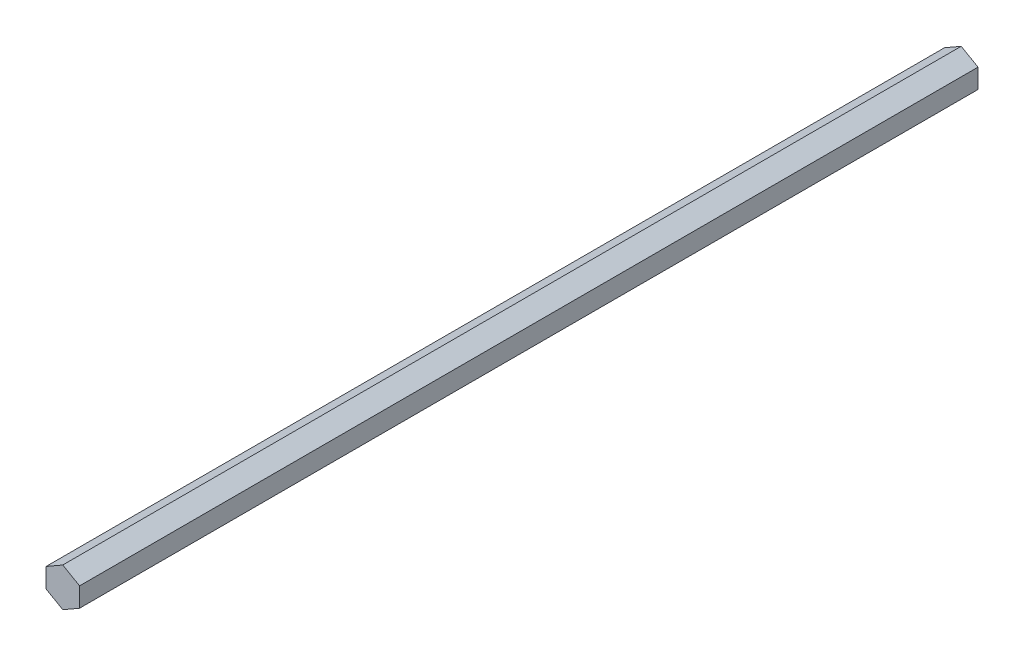
ISO-10303-21;
HEADER;
FILE_DESCRIPTION(('STEP AP214'),'2;1');
FILE_NAME('part.step','',(''),(''),'','','');
FILE_SCHEMA(('AUTOMOTIVE_DESIGN { 1 0 10303 214 1 1 1 1 }'));
ENDSEC;
DATA;
#1=APPLICATION_CONTEXT('core data for automotive mechanical design processes');
#2=APPLICATION_PROTOCOL_DEFINITION('international standard','automotive_design',2000,#1);
#3=PRODUCT_CONTEXT('',#1,'mechanical');
#4=PRODUCT('Part','Part','',(#3));
#5=PRODUCT_RELATED_PRODUCT_CATEGORY('part','',(#4));
#6=PRODUCT_DEFINITION_FORMATION('','',#4);
#7=PRODUCT_DEFINITION_CONTEXT('part definition',#1,'design');
#8=PRODUCT_DEFINITION('design','',#6,#7);
#9=PRODUCT_DEFINITION_SHAPE('','',#8);
#10=(LENGTH_UNIT() NAMED_UNIT(*) SI_UNIT(.MILLI.,.METRE.));
#11=(NAMED_UNIT(*) PLANE_ANGLE_UNIT() SI_UNIT($,.RADIAN.));
#12=(NAMED_UNIT(*) SI_UNIT($,.STERADIAN.) SOLID_ANGLE_UNIT());
#13=UNCERTAINTY_MEASURE_WITH_UNIT(LENGTH_MEASURE(1.E-05),#10,'distance_accuracy_value','');
#14=(GEOMETRIC_REPRESENTATION_CONTEXT(3) GLOBAL_UNCERTAINTY_ASSIGNED_CONTEXT((#13)) GLOBAL_UNIT_ASSIGNED_CONTEXT((#10,
#11,#12)) REPRESENTATION_CONTEXT('',''));
#15=CARTESIAN_POINT('',(0.,0.,0.));
#16=DIRECTION('',(0.,0.,1.));
#17=DIRECTION('',(1.,0.,0.));
#18=AXIS2_PLACEMENT_3D('',#15,#16,#17);
#19=CARTESIAN_POINT('',(6.34999999999995,3.66617420935419,340.));
#20=DIRECTION('',(-0.499999999999995,-0.866025403784442,0.));
#21=DIRECTION('',(0.866025403784442,-0.499999999999995,0.));
#22=AXIS2_PLACEMENT_3D('',#19,#20,#21);
#23=PLANE('',#22);
#24=DIRECTION('',(-0.866025403784441,0.499999999999995,0.));
#25=VECTOR('',#24,1.);
#26=CARTESIAN_POINT('',(6.34999999999995,3.66617420935419,0.));
#27=LINE('',#26,#25);
#28=CARTESIAN_POINT('',(6.34999999999995,3.66617420935419,0.));
#29=VERTEX_POINT('',#28);
#30=CARTESIAN_POINT('',(0.,7.33234841870824,0.));
#31=VERTEX_POINT('',#30);
#32=EDGE_CURVE('E121',#29,#31,#27,.T.);
#33=ORIENTED_EDGE('',*,*,#32,.T.);
#34=DIRECTION('',(0.,0.,-1.));
#35=VECTOR('',#34,1.);
#36=CARTESIAN_POINT('',(0.,7.33234841870824,340.));
#37=LINE('',#36,#35);
#38=CARTESIAN_POINT('',(0.,7.33234841870824,340.));
#39=VERTEX_POINT('',#38);
#40=EDGE_CURVE('E11',#39,#31,#37,.T.);
#41=ORIENTED_EDGE('',*,*,#40,.F.);
#42=DIRECTION('',(-0.866025403784441,0.499999999999995,0.));
#43=VECTOR('',#42,1.);
#44=CARTESIAN_POINT('',(6.34999999999995,3.66617420935419,340.));
#45=LINE('',#44,#43);
#46=CARTESIAN_POINT('',(6.34999999999995,3.66617420935419,340.));
#47=VERTEX_POINT('',#46);
#48=EDGE_CURVE('E131',#47,#39,#45,.T.);
#49=ORIENTED_EDGE('',*,*,#48,.F.);
#50=DIRECTION('',(0.,0.,-1.));
#51=VECTOR('',#50,1.);
#52=CARTESIAN_POINT('',(6.34999999999995,3.66617420935419,340.));
#53=LINE('',#52,#51);
#54=EDGE_CURVE('E117',#47,#29,#53,.T.);
#55=ORIENTED_EDGE('',*,*,#54,.T.);
#56=EDGE_LOOP('',(#33,#41,#49,#55));
#57=FACE_BOUND('',#56,.T.);
#58=ADVANCED_FACE('F37',(#57),#23,.F.);
#59=CARTESIAN_POINT('',(0.,7.33234841870824,340.));
#60=DIRECTION('',(0.500000000000001,-0.866025403784438,0.));
#61=DIRECTION('',(0.866025403784438,0.500000000000001,0.));
#62=AXIS2_PLACEMENT_3D('',#59,#60,#61);
#63=PLANE('',#62);
#64=DIRECTION('',(-0.866025403784438,-0.500000000000001,0.));
#65=VECTOR('',#64,1.);
#66=CARTESIAN_POINT('',(0.,7.33234841870824,0.));
#67=LINE('',#66,#65);
#68=CARTESIAN_POINT('',(-6.35,3.6661742093541,0.));
#69=VERTEX_POINT('',#68);
#70=EDGE_CURVE('E124',#31,#69,#67,.T.);
#71=ORIENTED_EDGE('',*,*,#70,.T.);
#72=DIRECTION('',(0.,0.,-1.));
#73=VECTOR('',#72,1.);
#74=CARTESIAN_POINT('',(-6.35,3.6661742093541,340.));
#75=LINE('',#74,#73);
#76=CARTESIAN_POINT('',(-6.35,3.6661742093541,340.));
#77=VERTEX_POINT('',#76);
#78=EDGE_CURVE('E45',#77,#69,#75,.T.);
#79=ORIENTED_EDGE('',*,*,#78,.F.);
#80=DIRECTION('',(-0.866025403784438,-0.500000000000001,0.));
#81=VECTOR('',#80,1.);
#82=CARTESIAN_POINT('',(0.,7.33234841870824,340.));
#83=LINE('',#82,#81);
#84=EDGE_CURVE('E90',#39,#77,#83,.T.);
#85=ORIENTED_EDGE('',*,*,#84,.F.);
#86=ORIENTED_EDGE('',*,*,#40,.T.);
#87=EDGE_LOOP('',(#71,#79,#85,#86));
#88=FACE_BOUND('',#87,.T.);
#89=ADVANCED_FACE('F155',(#88),#63,.F.);
#90=CARTESIAN_POINT('',(-6.35,3.6661742093541,340.));
#91=DIRECTION('',(1.,0.,0.));
#92=DIRECTION('',(0.,1.,0.));
#93=AXIS2_PLACEMENT_3D('',#90,#91,#92);
#94=PLANE('',#93);
#95=DIRECTION('',(0.,-1.,0.));
#96=VECTOR('',#95,1.);
#97=CARTESIAN_POINT('',(-6.35,3.6661742093541,0.));
#98=LINE('',#97,#96);
#99=CARTESIAN_POINT('',(-6.34999999999997,-3.66617420935415,0.));
#100=VERTEX_POINT('',#99);
#101=EDGE_CURVE('E126',#69,#100,#98,.T.);
#102=ORIENTED_EDGE('',*,*,#101,.T.);
#103=DIRECTION('',(0.,0.,-1.));
#104=VECTOR('',#103,1.);
#105=CARTESIAN_POINT('',(-6.34999999999997,-3.66617420935415,340.));
#106=LINE('',#105,#104);
#107=CARTESIAN_POINT('',(-6.34999999999997,-3.66617420935415,340.));
#108=VERTEX_POINT('',#107);
#109=EDGE_CURVE('E112',#108,#100,#106,.T.);
#110=ORIENTED_EDGE('',*,*,#109,.F.);
#111=DIRECTION('',(0.,-1.,0.));
#112=VECTOR('',#111,1.);
#113=CARTESIAN_POINT('',(-6.35,3.6661742093541,340.));
#114=LINE('',#113,#112);
#115=EDGE_CURVE('E103',#77,#108,#114,.T.);
#116=ORIENTED_EDGE('',*,*,#115,.F.);
#117=ORIENTED_EDGE('',*,*,#78,.T.);
#118=EDGE_LOOP('',(#102,#110,#116,#117));
#119=FACE_BOUND('',#118,.T.);
#120=ADVANCED_FACE('F137',(#119),#94,.F.);
#121=CARTESIAN_POINT('',(-6.34999999999997,-3.66617420935415,340.));
#122=DIRECTION('',(0.499999999999995,0.866025403784442,0.));
#123=DIRECTION('',(-0.866025403784442,0.499999999999995,0.));
#124=AXIS2_PLACEMENT_3D('',#121,#122,#123);
#125=PLANE('',#124);
#126=DIRECTION('',(0.866025403784442,-0.499999999999995,0.));
#127=VECTOR('',#126,1.);
#128=CARTESIAN_POINT('',(-6.34999999999997,-3.66617420935415,0.));
#129=LINE('',#128,#127);
#130=CARTESIAN_POINT('',(0.,-7.33234841870823,0.));
#131=VERTEX_POINT('',#130);
#132=EDGE_CURVE('E111',#100,#131,#129,.T.);
#133=ORIENTED_EDGE('',*,*,#132,.T.);
#134=DIRECTION('',(0.,0.,-1.));
#135=VECTOR('',#134,1.);
#136=CARTESIAN_POINT('',(0.,-7.33234841870823,340.));
#137=LINE('',#136,#135);
#138=CARTESIAN_POINT('',(0.,-7.33234841870823,340.));
#139=VERTEX_POINT('',#138);
#140=EDGE_CURVE('E108',#139,#131,#137,.T.);
#141=ORIENTED_EDGE('',*,*,#140,.F.);
#142=DIRECTION('',(0.866025403784442,-0.499999999999995,0.));
#143=VECTOR('',#142,1.);
#144=CARTESIAN_POINT('',(-6.34999999999997,-3.66617420935415,340.));
#145=LINE('',#144,#143);
#146=EDGE_CURVE('E97',#108,#139,#145,.T.);
#147=ORIENTED_EDGE('',*,*,#146,.F.);
#148=ORIENTED_EDGE('',*,*,#109,.T.);
#149=EDGE_LOOP('',(#133,#141,#147,#148));
#150=FACE_BOUND('',#149,.T.);
#151=ADVANCED_FACE('F109',(#150),#125,.F.);
#152=CARTESIAN_POINT('',(0.,-7.33234841870823,340.));
#153=DIRECTION('',(-0.500000000000007,0.866025403784435,0.));
#154=DIRECTION('',(-0.866025403784435,-0.500000000000007,0.));
#155=AXIS2_PLACEMENT_3D('',#152,#153,#154);
#156=PLANE('',#155);
#157=DIRECTION('',(0.866025403784435,0.500000000000007,0.));
#158=VECTOR('',#157,1.);
#159=CARTESIAN_POINT('',(0.,-7.33234841870823,0.));
#160=LINE('',#159,#158);
#161=CARTESIAN_POINT('',(6.35000000000002,-3.66617420935406,0.));
#162=VERTEX_POINT('',#161);
#163=EDGE_CURVE('E76',#131,#162,#160,.T.);
#164=ORIENTED_EDGE('',*,*,#163,.T.);
#165=DIRECTION('',(0.,0.,-1.));
#166=VECTOR('',#165,1.);
#167=CARTESIAN_POINT('',(6.35000000000002,-3.66617420935406,340.));
#168=LINE('',#167,#166);
#169=CARTESIAN_POINT('',(6.35000000000002,-3.66617420935406,340.));
#170=VERTEX_POINT('',#169);
#171=EDGE_CURVE('E113',#170,#162,#168,.T.);
#172=ORIENTED_EDGE('',*,*,#171,.F.);
#173=DIRECTION('',(0.866025403784435,0.500000000000007,0.));
#174=VECTOR('',#173,1.);
#175=CARTESIAN_POINT('',(0.,-7.33234841870823,340.));
#176=LINE('',#175,#174);
#177=EDGE_CURVE('E101',#139,#170,#176,.T.);
#178=ORIENTED_EDGE('',*,*,#177,.F.);
#179=ORIENTED_EDGE('',*,*,#140,.T.);
#180=EDGE_LOOP('',(#164,#172,#178,#179));
#181=FACE_BOUND('',#180,.T.);
#182=ADVANCED_FACE('F115',(#181),#156,.F.);
#183=CARTESIAN_POINT('',(6.35000000000002,-3.66617420935406,340.));
#184=DIRECTION('',(-1.,0.,0.));
#185=DIRECTION('',(0.,-1.,0.));
#186=AXIS2_PLACEMENT_3D('',#183,#184,#185);
#187=PLANE('',#186);
#188=DIRECTION('',(0.,1.,0.));
#189=VECTOR('',#188,1.);
#190=CARTESIAN_POINT('',(6.35000000000002,-3.66617420935406,0.));
#191=LINE('',#190,#189);
#192=EDGE_CURVE('E82',#162,#29,#191,.T.);
#193=ORIENTED_EDGE('',*,*,#192,.T.);
#194=ORIENTED_EDGE('',*,*,#54,.F.);
#195=DIRECTION('',(0.,1.,0.));
#196=VECTOR('',#195,1.);
#197=CARTESIAN_POINT('',(6.35000000000002,-3.66617420935406,340.));
#198=LINE('',#197,#196);
#199=EDGE_CURVE('E53',#170,#47,#198,.T.);
#200=ORIENTED_EDGE('',*,*,#199,.F.);
#201=ORIENTED_EDGE('',*,*,#171,.T.);
#202=EDGE_LOOP('',(#193,#194,#200,#201));
#203=FACE_BOUND('',#202,.T.);
#204=ADVANCED_FACE('F144',(#203),#187,.F.);
#205=CARTESIAN_POINT('',(0.,0.,340.));
#206=DIRECTION('',(0.,0.,1.));
#207=DIRECTION('',(1.,0.,0.));
#208=AXIS2_PLACEMENT_3D('',#205,#206,#207);
#209=PLANE('',#208);
#210=ORIENTED_EDGE('',*,*,#48,.T.);
#211=ORIENTED_EDGE('',*,*,#84,.T.);
#212=ORIENTED_EDGE('',*,*,#115,.T.);
#213=ORIENTED_EDGE('',*,*,#146,.T.);
#214=ORIENTED_EDGE('',*,*,#177,.T.);
#215=ORIENTED_EDGE('',*,*,#199,.T.);
#216=EDGE_LOOP('',(#210,#211,#212,#213,#214,#215));
#217=FACE_BOUND('',#216,.T.);
#218=ADVANCED_FACE('F99',(#217),#209,.T.);
#219=CARTESIAN_POINT('',(0.,0.,0.));
#220=DIRECTION('',(0.,0.,1.));
#221=DIRECTION('',(1.,0.,0.));
#222=AXIS2_PLACEMENT_3D('',#219,#220,#221);
#223=PLANE('',#222);
#224=ORIENTED_EDGE('',*,*,#32,.F.);
#225=ORIENTED_EDGE('',*,*,#192,.F.);
#226=ORIENTED_EDGE('',*,*,#163,.F.);
#227=ORIENTED_EDGE('',*,*,#132,.F.);
#228=ORIENTED_EDGE('',*,*,#101,.F.);
#229=ORIENTED_EDGE('',*,*,#70,.F.);
#230=EDGE_LOOP('',(#224,#225,#226,#227,#228,#229));
#231=FACE_BOUND('',#230,.T.);
#232=ADVANCED_FACE('F140',(#231),#223,.F.);
#233=CLOSED_SHELL('',(#58,#89,#120,#151,#182,#204,#218,#232));
#234=MANIFOLD_SOLID_BREP('B2',#233);
#235=ADVANCED_BREP_SHAPE_REPRESENTATION('',(#18,#234),#14);
#236=SHAPE_DEFINITION_REPRESENTATION(#9,#235);
ENDSEC;
END-ISO-10303-21;
